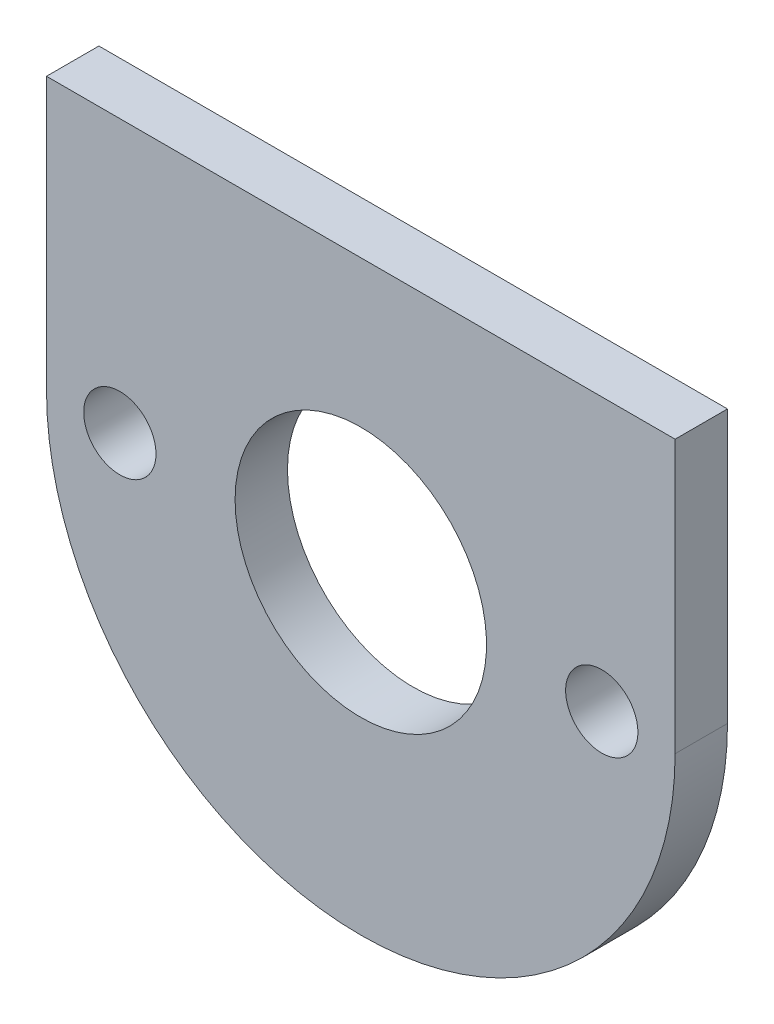
ISO-10303-21;
HEADER;
FILE_DESCRIPTION(('STEP AP214'),'2;1');
FILE_NAME('part.step','',(''),(''),'','','');
FILE_SCHEMA(('AUTOMOTIVE_DESIGN { 1 0 10303 214 1 1 1 1 }'));
ENDSEC;
DATA;
#1=APPLICATION_CONTEXT('core data for automotive mechanical design processes');
#2=APPLICATION_PROTOCOL_DEFINITION('international standard','automotive_design',2000,#1);
#3=PRODUCT_CONTEXT('',#1,'mechanical');
#4=PRODUCT('Part','Part','',(#3));
#5=PRODUCT_RELATED_PRODUCT_CATEGORY('part','',(#4));
#6=PRODUCT_DEFINITION_FORMATION('','',#4);
#7=PRODUCT_DEFINITION_CONTEXT('part definition',#1,'design');
#8=PRODUCT_DEFINITION('design','',#6,#7);
#9=PRODUCT_DEFINITION_SHAPE('','',#8);
#10=(LENGTH_UNIT() NAMED_UNIT(*) SI_UNIT(.MILLI.,.METRE.));
#11=(NAMED_UNIT(*) PLANE_ANGLE_UNIT() SI_UNIT($,.RADIAN.));
#12=(NAMED_UNIT(*) SI_UNIT($,.STERADIAN.) SOLID_ANGLE_UNIT());
#13=UNCERTAINTY_MEASURE_WITH_UNIT(LENGTH_MEASURE(1.E-05),#10,'distance_accuracy_value','');
#14=(GEOMETRIC_REPRESENTATION_CONTEXT(3) GLOBAL_UNCERTAINTY_ASSIGNED_CONTEXT((#13)) GLOBAL_UNIT_ASSIGNED_CONTEXT((#10,
#11,#12)) REPRESENTATION_CONTEXT('',''));
#15=CARTESIAN_POINT('',(0.,0.,0.));
#16=DIRECTION('',(0.,0.,1.));
#17=DIRECTION('',(1.,0.,0.));
#18=AXIS2_PLACEMENT_3D('',#15,#16,#17);
#19=CARTESIAN_POINT('',(-157.975088035676,41.2248544872213,612.350000977516));
#20=DIRECTION('',(0.,0.,-1.));
#21=DIRECTION('',(1.,0.,0.));
#22=AXIS2_PLACEMENT_3D('',#19,#20,#21);
#23=CYLINDRICAL_SURFACE('',#22,1.725);
#24=CARTESIAN_POINT('',(-157.975088035676,41.2248544872213,612.100000977516));
#25=DIRECTION('',(0.,0.,-1.));
#26=DIRECTION('',(1.,0.,0.));
#27=AXIS2_PLACEMENT_3D('',#24,#25,#26);
#28=CIRCLE('',#27,1.725);
#29=CARTESIAN_POINT('',(-156.250088035676,41.2248544872213,612.100000977516));
#30=VERTEX_POINT('',#29);
#31=EDGE_CURVE('E10',#30,#30,#28,.T.);
#32=ORIENTED_EDGE('',*,*,#31,.F.);
#33=EDGE_LOOP('',(#32));
#34=FACE_BOUND('',#33,.T.);
#35=CARTESIAN_POINT('',(-157.975088035676,41.2248544872213,609.600000977516));
#36=DIRECTION('',(0.,0.,1.));
#37=DIRECTION('',(1.,0.,0.));
#38=AXIS2_PLACEMENT_3D('',#35,#36,#37);
#39=CIRCLE('',#38,1.725);
#40=CARTESIAN_POINT('',(-156.250088035676,41.2248544872213,609.600000977516));
#41=VERTEX_POINT('',#40);
#42=EDGE_CURVE('E95',#41,#41,#39,.T.);
#43=ORIENTED_EDGE('',*,*,#42,.F.);
#44=EDGE_LOOP('',(#43));
#45=FACE_BOUND('',#44,.T.);
#46=ADVANCED_FACE('F15',(#34,#45),#23,.F.);
#47=CARTESIAN_POINT('',(-134.975088035676,41.2248544872213,613.849990844727));
#48=DIRECTION('',(0.,0.,1.));
#49=DIRECTION('',(1.,0.,0.));
#50=AXIS2_PLACEMENT_3D('',#47,#48,#49);
#51=CYLINDRICAL_SURFACE('',#50,1.725);
#52=CARTESIAN_POINT('',(-134.975088035676,41.2248544872213,612.100000977516));
#53=DIRECTION('',(0.,0.,-1.));
#54=DIRECTION('',(1.,0.,0.));
#55=AXIS2_PLACEMENT_3D('',#52,#53,#54);
#56=CIRCLE('',#55,1.725);
#57=CARTESIAN_POINT('',(-133.250088035676,41.2248544872213,612.100000977516));
#58=VERTEX_POINT('',#57);
#59=EDGE_CURVE('E25',#58,#58,#56,.T.);
#60=ORIENTED_EDGE('',*,*,#59,.F.);
#61=EDGE_LOOP('',(#60));
#62=FACE_BOUND('',#61,.T.);
#63=CARTESIAN_POINT('',(-134.975088035676,41.2248544872213,609.600000977516));
#64=DIRECTION('',(0.,0.,1.));
#65=DIRECTION('',(1.,0.,0.));
#66=AXIS2_PLACEMENT_3D('',#63,#64,#65);
#67=CIRCLE('',#66,1.725);
#68=CARTESIAN_POINT('',(-133.250088035676,41.2248544872213,609.600000977516));
#69=VERTEX_POINT('',#68);
#70=EDGE_CURVE('E91',#69,#69,#67,.T.);
#71=ORIENTED_EDGE('',*,*,#70,.F.);
#72=EDGE_LOOP('',(#71));
#73=FACE_BOUND('',#72,.T.);
#74=ADVANCED_FACE('F119',(#62,#73),#51,.F.);
#75=CARTESIAN_POINT('',(-146.475088035676,41.7632486689106,612.100000977516));
#76=DIRECTION('',(0.,0.,-1.));
#77=DIRECTION('',(1.,0.,0.));
#78=AXIS2_PLACEMENT_3D('',#75,#76,#77);
#79=PLANE('',#78);
#80=ORIENTED_EDGE('',*,*,#31,.T.);
#81=EDGE_LOOP('',(#80));
#82=FACE_BOUND('',#81,.T.);
#83=ORIENTED_EDGE('',*,*,#59,.T.);
#84=EDGE_LOOP('',(#83));
#85=FACE_BOUND('',#84,.T.);
#86=CARTESIAN_POINT('',(-146.475088035676,41.2248544872213,612.100000977516));
#87=DIRECTION('',(0.,0.,1.));
#88=DIRECTION('',(-1.,0.,0.));
#89=AXIS2_PLACEMENT_3D('',#86,#87,#88);
#90=CIRCLE('',#89,6.);
#91=CARTESIAN_POINT('',(-152.475088035676,41.2248544872213,612.100000977516));
#92=VERTEX_POINT('',#91);
#93=EDGE_CURVE('E87',#92,#92,#90,.T.);
#94=ORIENTED_EDGE('',*,*,#93,.F.);
#95=EDGE_LOOP('',(#94));
#96=FACE_BOUND('',#95,.T.);
#97=DIRECTION('',(1.,0.,0.));
#98=VECTOR('',#97,1.);
#99=CARTESIAN_POINT('',(-146.475088035676,54.2248544872214,612.100000977516));
#100=LINE('',#99,#98);
#101=CARTESIAN_POINT('',(-161.475088035676,54.2248544872214,612.100000977516));
#102=VERTEX_POINT('',#101);
#103=CARTESIAN_POINT('',(-131.475088035676,54.2248544872214,612.100000977516));
#104=VERTEX_POINT('',#103);
#105=EDGE_CURVE('E34',#102,#104,#100,.T.);
#106=ORIENTED_EDGE('',*,*,#105,.F.);
#107=DIRECTION('',(0.,1.,0.));
#108=VECTOR('',#107,1.);
#109=CARTESIAN_POINT('',(-161.475088035676,44.744051578066,612.100000977516));
#110=LINE('',#109,#108);
#111=CARTESIAN_POINT('',(-161.475088035676,41.2248544872213,612.100000977516));
#112=VERTEX_POINT('',#111);
#113=EDGE_CURVE('E76',#112,#102,#110,.T.);
#114=ORIENTED_EDGE('',*,*,#113,.F.);
#115=CARTESIAN_POINT('',(-146.475088035676,41.2248544872213,612.100000977516));
#116=DIRECTION('',(0.,0.,-1.));
#117=DIRECTION('',(1.,0.,0.));
#118=AXIS2_PLACEMENT_3D('',#115,#116,#117);
#119=CIRCLE('',#118,15.);
#120=CARTESIAN_POINT('',(-131.475088035676,41.2248544872213,612.100000977516));
#121=VERTEX_POINT('',#120);
#122=EDGE_CURVE('E79',#121,#112,#119,.T.);
#123=ORIENTED_EDGE('',*,*,#122,.F.);
#124=DIRECTION('',(0.,-1.,0.));
#125=VECTOR('',#124,1.);
#126=CARTESIAN_POINT('',(-131.475088035676,44.744051578066,612.100000977516));
#127=LINE('',#126,#125);
#128=EDGE_CURVE('E66',#104,#121,#127,.T.);
#129=ORIENTED_EDGE('',*,*,#128,.F.);
#130=EDGE_LOOP('',(#106,#114,#123,#129));
#131=FACE_BOUND('',#130,.T.);
#132=ADVANCED_FACE('F101',(#82,#85,#96,#131),#79,.F.);
#133=CARTESIAN_POINT('',(-146.475088035676,41.2248544872213,612.100000977516));
#134=DIRECTION('',(0.,0.,1.));
#135=DIRECTION('',(1.,0.,0.));
#136=AXIS2_PLACEMENT_3D('',#133,#134,#135);
#137=CYLINDRICAL_SURFACE('',#136,15.);
#138=ORIENTED_EDGE('',*,*,#122,.T.);
#139=DIRECTION('',(0.,0.,-1.));
#140=VECTOR('',#139,1.);
#141=CARTESIAN_POINT('',(-161.475088035676,41.2248544872213,612.100000977516));
#142=LINE('',#141,#140);
#143=CARTESIAN_POINT('',(-161.475088035676,41.2248544872213,609.600000977516));
#144=VERTEX_POINT('',#143);
#145=EDGE_CURVE('E75',#112,#144,#142,.T.);
#146=ORIENTED_EDGE('',*,*,#145,.T.);
#147=CARTESIAN_POINT('',(-146.475088035676,41.2248544872213,609.600000977516));
#148=DIRECTION('',(0.,0.,-1.));
#149=DIRECTION('',(1.,0.,0.));
#150=AXIS2_PLACEMENT_3D('',#147,#148,#149);
#151=CIRCLE('',#150,15.);
#152=CARTESIAN_POINT('',(-131.475088035676,41.2248544872213,609.600000977516));
#153=VERTEX_POINT('',#152);
#154=EDGE_CURVE('E85',#153,#144,#151,.T.);
#155=ORIENTED_EDGE('',*,*,#154,.F.);
#156=DIRECTION('',(0.,0.,1.));
#157=VECTOR('',#156,1.);
#158=CARTESIAN_POINT('',(-131.475088035676,41.2248544872213,612.100000977516));
#159=LINE('',#158,#157);
#160=EDGE_CURVE('E71',#153,#121,#159,.T.);
#161=ORIENTED_EDGE('',*,*,#160,.T.);
#162=EDGE_LOOP('',(#138,#146,#155,#161));
#163=FACE_BOUND('',#162,.T.);
#164=ADVANCED_FACE('F98',(#163),#137,.T.);
#165=CARTESIAN_POINT('',(-161.475088035676,47.7248544872214,610.850001692772));
#166=DIRECTION('',(1.,0.,0.));
#167=DIRECTION('',(0.,0.,1.));
#168=AXIS2_PLACEMENT_3D('',#165,#166,#167);
#169=PLANE('',#168);
#170=ORIENTED_EDGE('',*,*,#113,.T.);
#171=DIRECTION('',(0.,0.,-1.));
#172=VECTOR('',#171,1.);
#173=CARTESIAN_POINT('',(-161.475088035676,54.2248544872214,610.850001692772));
#174=LINE('',#173,#172);
#175=CARTESIAN_POINT('',(-161.475088035676,54.2248544872214,609.600001692772));
#176=VERTEX_POINT('',#175);
#177=EDGE_CURVE('E81',#102,#176,#174,.T.);
#178=ORIENTED_EDGE('',*,*,#177,.T.);
#179=DIRECTION('',(0.,1.,0.));
#180=VECTOR('',#179,1.);
#181=CARTESIAN_POINT('',(-161.475088035676,44.4748544872213,609.600000977516));
#182=LINE('',#181,#180);
#183=EDGE_CURVE('E53',#144,#176,#182,.T.);
#184=ORIENTED_EDGE('',*,*,#183,.F.);
#185=ORIENTED_EDGE('',*,*,#145,.F.);
#186=EDGE_LOOP('',(#170,#178,#184,#185));
#187=FACE_BOUND('',#186,.T.);
#188=ADVANCED_FACE('F100',(#187),#169,.F.);
#189=CARTESIAN_POINT('',(-146.475088035676,41.2248544872213,611.350000619888));
#190=DIRECTION('',(0.,0.,1.));
#191=DIRECTION('',(-1.,0.,0.));
#192=AXIS2_PLACEMENT_3D('',#189,#190,#191);
#193=CYLINDRICAL_SURFACE('',#192,6.);
#194=ORIENTED_EDGE('',*,*,#93,.T.);
#195=EDGE_LOOP('',(#194));
#196=FACE_BOUND('',#195,.T.);
#197=CARTESIAN_POINT('',(-146.475088035676,41.2248544872213,609.600000977516));
#198=DIRECTION('',(0.,0.,1.));
#199=DIRECTION('',(-1.,0.,0.));
#200=AXIS2_PLACEMENT_3D('',#197,#198,#199);
#201=CIRCLE('',#200,6.);
#202=CARTESIAN_POINT('',(-152.475088035676,41.2248544872213,609.600000977516));
#203=VERTEX_POINT('',#202);
#204=EDGE_CURVE('E89',#203,#203,#201,.T.);
#205=ORIENTED_EDGE('',*,*,#204,.F.);
#206=EDGE_LOOP('',(#205));
#207=FACE_BOUND('',#206,.T.);
#208=ADVANCED_FACE('F115',(#196,#207),#193,.F.);
#209=CARTESIAN_POINT('',(-146.475088035676,54.2248544872214,610.850001692772));
#210=DIRECTION('',(0.,-1.,0.));
#211=DIRECTION('',(0.,0.,1.));
#212=AXIS2_PLACEMENT_3D('',#209,#210,#211);
#213=PLANE('',#212);
#214=ORIENTED_EDGE('',*,*,#105,.T.);
#215=DIRECTION('',(0.,0.,-1.));
#216=VECTOR('',#215,1.);
#217=CARTESIAN_POINT('',(-131.475088035676,54.2248544872214,610.850001692772));
#218=LINE('',#217,#216);
#219=CARTESIAN_POINT('',(-131.475088035676,54.2248544872214,609.600001692772));
#220=VERTEX_POINT('',#219);
#221=EDGE_CURVE('E63',#104,#220,#218,.T.);
#222=ORIENTED_EDGE('',*,*,#221,.T.);
#223=DIRECTION('',(1.,0.,0.));
#224=VECTOR('',#223,1.);
#225=CARTESIAN_POINT('',(-146.475088035676,54.2248544872214,609.600001692772));
#226=LINE('',#225,#224);
#227=EDGE_CURVE('E57',#176,#220,#226,.T.);
#228=ORIENTED_EDGE('',*,*,#227,.F.);
#229=ORIENTED_EDGE('',*,*,#177,.F.);
#230=EDGE_LOOP('',(#214,#222,#228,#229));
#231=FACE_BOUND('',#230,.T.);
#232=ADVANCED_FACE('F64',(#231),#213,.F.);
#233=CARTESIAN_POINT('',(-131.475088035676,47.7248544872214,610.850001692772));
#234=DIRECTION('',(-1.,0.,0.));
#235=DIRECTION('',(0.,0.,-1.));
#236=AXIS2_PLACEMENT_3D('',#233,#234,#235);
#237=PLANE('',#236);
#238=ORIENTED_EDGE('',*,*,#128,.T.);
#239=ORIENTED_EDGE('',*,*,#160,.F.);
#240=DIRECTION('',(0.,-1.,0.));
#241=VECTOR('',#240,1.);
#242=CARTESIAN_POINT('',(-131.475088035676,44.4748544872213,609.600000977516));
#243=LINE('',#242,#241);
#244=EDGE_CURVE('E19',#220,#153,#243,.T.);
#245=ORIENTED_EDGE('',*,*,#244,.F.);
#246=ORIENTED_EDGE('',*,*,#221,.F.);
#247=EDGE_LOOP('',(#238,#239,#245,#246));
#248=FACE_BOUND('',#247,.T.);
#249=ADVANCED_FACE('F69',(#248),#237,.F.);
#250=CARTESIAN_POINT('',(-146.475088035676,41.2248544872213,609.600000977516));
#251=DIRECTION('',(0.,0.,-1.));
#252=DIRECTION('',(-1.,0.,0.));
#253=AXIS2_PLACEMENT_3D('',#250,#251,#252);
#254=PLANE('',#253);
#255=ORIENTED_EDGE('',*,*,#42,.T.);
#256=EDGE_LOOP('',(#255));
#257=FACE_BOUND('',#256,.T.);
#258=ORIENTED_EDGE('',*,*,#70,.T.);
#259=EDGE_LOOP('',(#258));
#260=FACE_BOUND('',#259,.T.);
#261=ORIENTED_EDGE('',*,*,#204,.T.);
#262=EDGE_LOOP('',(#261));
#263=FACE_BOUND('',#262,.T.);
#264=ORIENTED_EDGE('',*,*,#154,.T.);
#265=ORIENTED_EDGE('',*,*,#183,.T.);
#266=ORIENTED_EDGE('',*,*,#227,.T.);
#267=ORIENTED_EDGE('',*,*,#244,.T.);
#268=EDGE_LOOP('',(#264,#265,#266,#267));
#269=FACE_BOUND('',#268,.T.);
#270=ADVANCED_FACE('F17',(#257,#260,#263,#269),#254,.T.);
#271=CLOSED_SHELL('',(#46,#74,#132,#164,#188,#208,#232,#249,#270));
#272=MANIFOLD_SOLID_BREP('B1',#271);
#273=ADVANCED_BREP_SHAPE_REPRESENTATION('',(#18,#272),#14);
#274=SHAPE_DEFINITION_REPRESENTATION(#9,#273);
ENDSEC;
END-ISO-10303-21;
